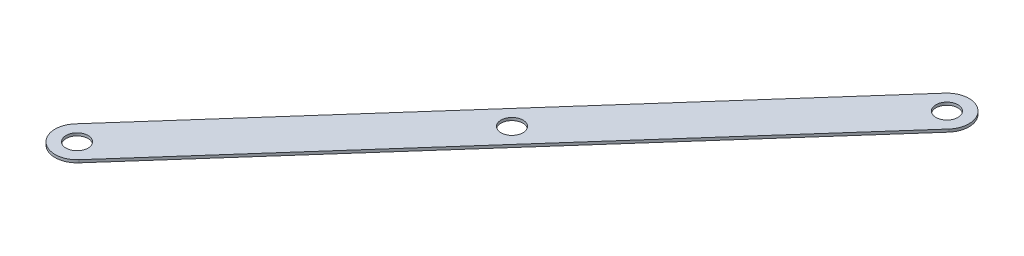
ISO-10303-21;
HEADER;
FILE_DESCRIPTION(('STEP AP214'),'2;1');
FILE_NAME('part.step','',(''),(''),'','','');
FILE_SCHEMA(('AUTOMOTIVE_DESIGN { 1 0 10303 214 1 1 1 1 }'));
ENDSEC;
DATA;
#1=APPLICATION_CONTEXT('core data for automotive mechanical design processes');
#2=APPLICATION_PROTOCOL_DEFINITION('international standard','automotive_design',2000,#1);
#3=PRODUCT_CONTEXT('',#1,'mechanical');
#4=PRODUCT('Part','Part','',(#3));
#5=PRODUCT_RELATED_PRODUCT_CATEGORY('part','',(#4));
#6=PRODUCT_DEFINITION_FORMATION('','',#4);
#7=PRODUCT_DEFINITION_CONTEXT('part definition',#1,'design');
#8=PRODUCT_DEFINITION('design','',#6,#7);
#9=PRODUCT_DEFINITION_SHAPE('','',#8);
#10=(LENGTH_UNIT() NAMED_UNIT(*) SI_UNIT(.MILLI.,.METRE.));
#11=(NAMED_UNIT(*) PLANE_ANGLE_UNIT() SI_UNIT($,.RADIAN.));
#12=(NAMED_UNIT(*) SI_UNIT($,.STERADIAN.) SOLID_ANGLE_UNIT());
#13=UNCERTAINTY_MEASURE_WITH_UNIT(LENGTH_MEASURE(1.E-05),#10,'distance_accuracy_value','');
#14=(GEOMETRIC_REPRESENTATION_CONTEXT(3) GLOBAL_UNCERTAINTY_ASSIGNED_CONTEXT((#13)) GLOBAL_UNIT_ASSIGNED_CONTEXT((#10,
#11,#12)) REPRESENTATION_CONTEXT('',''));
#15=CARTESIAN_POINT('',(0.,0.,0.));
#16=DIRECTION('',(0.,0.,1.));
#17=DIRECTION('',(1.,0.,0.));
#18=AXIS2_PLACEMENT_3D('',#15,#16,#17);
#19=CARTESIAN_POINT('',(0.,1.5875,0.));
#20=DIRECTION('',(0.,1.,0.));
#21=DIRECTION('',(0.,0.,1.));
#22=AXIS2_PLACEMENT_3D('',#19,#20,#21);
#23=PLANE('',#22);
#24=CARTESIAN_POINT('',(235.633683701559,1.5875,-266.323350657116));
#25=DIRECTION('',(0.,1.,0.));
#26=DIRECTION('',(0.,0.,1.));
#27=AXIS2_PLACEMENT_3D('',#24,#25,#26);
#28=CIRCLE('',#27,6.34999999999999);
#29=CARTESIAN_POINT('',(235.633683701559,1.5875,-259.973350657116));
#30=VERTEX_POINT('',#29);
#31=EDGE_CURVE('E118',#30,#30,#28,.T.);
#32=ORIENTED_EDGE('',*,*,#31,.F.);
#33=EDGE_LOOP('',(#32));
#34=FACE_BOUND('',#33,.T.);
#35=CARTESIAN_POINT('',(0.,1.5875,0.));
#36=DIRECTION('',(0.,1.,0.));
#37=DIRECTION('',(0.,0.,1.));
#38=AXIS2_PLACEMENT_3D('',#35,#36,#37);
#39=CIRCLE('',#38,12.7);
#40=CARTESIAN_POINT('',(-9.51154823775415,1.5875,-8.41548870362711));
#41=VERTEX_POINT('',#40);
#42=CARTESIAN_POINT('',(9.51154823775415,1.5875,8.41548870362712));
#43=VERTEX_POINT('',#42);
#44=EDGE_CURVE('E88',#41,#43,#39,.T.);
#45=ORIENTED_EDGE('',*,*,#44,.T.);
#46=DIRECTION('',(0.662636905797411,0.,-0.748940806122375));
#47=VECTOR('',#46,1.);
#48=CARTESIAN_POINT('',(9.51154823775415,1.5875,8.41548870362712));
#49=LINE('',#48,#47);
#50=CARTESIAN_POINT('',(245.145231939314,1.5875,-257.907861953489));
#51=VERTEX_POINT('',#50);
#52=EDGE_CURVE('E83',#43,#51,#49,.T.);
#53=ORIENTED_EDGE('',*,*,#52,.T.);
#54=CARTESIAN_POINT('',(235.633683701559,1.5875,-266.323350657116));
#55=DIRECTION('',(0.,1.,0.));
#56=DIRECTION('',(0.,0.,1.));
#57=AXIS2_PLACEMENT_3D('',#54,#55,#56);
#58=CIRCLE('',#57,12.7);
#59=CARTESIAN_POINT('',(226.122135463805,1.5875,-274.738839360744));
#60=VERTEX_POINT('',#59);
#61=EDGE_CURVE('E86',#51,#60,#58,.T.);
#62=ORIENTED_EDGE('',*,*,#61,.T.);
#63=DIRECTION('',(-0.662636905797411,0.,0.748940806122375));
#64=VECTOR('',#63,1.);
#65=CARTESIAN_POINT('',(-9.51154823775415,1.5875,-8.41548870362711));
#66=LINE('',#65,#64);
#67=EDGE_CURVE('E53',#60,#41,#66,.T.);
#68=ORIENTED_EDGE('',*,*,#67,.T.);
#69=EDGE_LOOP('',(#45,#53,#62,#68));
#70=FACE_BOUND('',#69,.T.);
#71=CARTESIAN_POINT('',(117.81684185078,1.5875,-133.161675328558));
#72=DIRECTION('',(0.,1.,0.));
#73=DIRECTION('',(0.,0.,1.));
#74=AXIS2_PLACEMENT_3D('',#71,#72,#73);
#75=CIRCLE('',#74,6.34999999999999);
#76=CARTESIAN_POINT('',(117.81684185078,1.5875,-126.811675328558));
#77=VERTEX_POINT('',#76);
#78=EDGE_CURVE('E103',#77,#77,#75,.T.);
#79=ORIENTED_EDGE('',*,*,#78,.F.);
#80=EDGE_LOOP('',(#79));
#81=FACE_BOUND('',#80,.T.);
#82=CARTESIAN_POINT('',(0.,1.5875,0.));
#83=DIRECTION('',(0.,1.,0.));
#84=DIRECTION('',(0.,0.,1.));
#85=AXIS2_PLACEMENT_3D('',#82,#83,#84);
#86=CIRCLE('',#85,6.35);
#87=CARTESIAN_POINT('',(0.,1.5875,6.35));
#88=VERTEX_POINT('',#87);
#89=EDGE_CURVE('E124',#88,#88,#86,.T.);
#90=ORIENTED_EDGE('',*,*,#89,.F.);
#91=EDGE_LOOP('',(#90));
#92=FACE_BOUND('',#91,.T.);
#93=ADVANCED_FACE('F36',(#34,#70,#81,#92),#23,.T.);
#94=CARTESIAN_POINT('',(0.,0.,0.));
#95=DIRECTION('',(0.,1.,0.));
#96=DIRECTION('',(0.,0.,1.));
#97=AXIS2_PLACEMENT_3D('',#94,#95,#96);
#98=PLANE('',#97);
#99=CARTESIAN_POINT('',(0.,0.,0.));
#100=DIRECTION('',(0.,1.,0.));
#101=DIRECTION('',(0.,0.,1.));
#102=AXIS2_PLACEMENT_3D('',#99,#100,#101);
#103=CIRCLE('',#102,12.7);
#104=CARTESIAN_POINT('',(-9.51154823775415,0.,-8.41548870362711));
#105=VERTEX_POINT('',#104);
#106=CARTESIAN_POINT('',(9.51154823775415,0.,8.41548870362712));
#107=VERTEX_POINT('',#106);
#108=EDGE_CURVE('E100',#105,#107,#103,.T.);
#109=ORIENTED_EDGE('',*,*,#108,.F.);
#110=DIRECTION('',(-0.662636905797411,0.,0.748940806122375));
#111=VECTOR('',#110,1.);
#112=CARTESIAN_POINT('',(-9.51154823775415,0.,-8.41548870362711));
#113=LINE('',#112,#111);
#114=CARTESIAN_POINT('',(226.122135463805,0.,-274.738839360744));
#115=VERTEX_POINT('',#114);
#116=EDGE_CURVE('E76',#115,#105,#113,.T.);
#117=ORIENTED_EDGE('',*,*,#116,.F.);
#118=CARTESIAN_POINT('',(235.633683701559,0.,-266.323350657116));
#119=DIRECTION('',(0.,1.,0.));
#120=DIRECTION('',(0.,0.,1.));
#121=AXIS2_PLACEMENT_3D('',#118,#119,#120);
#122=CIRCLE('',#121,12.7);
#123=CARTESIAN_POINT('',(245.145231939314,0.,-257.907861953489));
#124=VERTEX_POINT('',#123);
#125=EDGE_CURVE('E70',#124,#115,#122,.T.);
#126=ORIENTED_EDGE('',*,*,#125,.F.);
#127=DIRECTION('',(0.662636905797411,0.,-0.748940806122375));
#128=VECTOR('',#127,1.);
#129=CARTESIAN_POINT('',(9.51154823775415,0.,8.41548870362712));
#130=LINE('',#129,#128);
#131=EDGE_CURVE('E92',#107,#124,#130,.T.);
#132=ORIENTED_EDGE('',*,*,#131,.F.);
#133=EDGE_LOOP('',(#109,#117,#126,#132));
#134=FACE_BOUND('',#133,.T.);
#135=CARTESIAN_POINT('',(117.81684185078,0.,-133.161675328558));
#136=DIRECTION('',(0.,1.,0.));
#137=DIRECTION('',(0.,0.,1.));
#138=AXIS2_PLACEMENT_3D('',#135,#136,#137);
#139=CIRCLE('',#138,6.34999999999999);
#140=CARTESIAN_POINT('',(117.81684185078,0.,-126.811675328558));
#141=VERTEX_POINT('',#140);
#142=EDGE_CURVE('E115',#141,#141,#139,.T.);
#143=ORIENTED_EDGE('',*,*,#142,.T.);
#144=EDGE_LOOP('',(#143));
#145=FACE_BOUND('',#144,.T.);
#146=CARTESIAN_POINT('',(235.633683701559,0.,-266.323350657116));
#147=DIRECTION('',(0.,1.,0.));
#148=DIRECTION('',(0.,0.,1.));
#149=AXIS2_PLACEMENT_3D('',#146,#147,#148);
#150=CIRCLE('',#149,6.34999999999999);
#151=CARTESIAN_POINT('',(235.633683701559,0.,-259.973350657116));
#152=VERTEX_POINT('',#151);
#153=EDGE_CURVE('E121',#152,#152,#150,.T.);
#154=ORIENTED_EDGE('',*,*,#153,.T.);
#155=EDGE_LOOP('',(#154));
#156=FACE_BOUND('',#155,.T.);
#157=CARTESIAN_POINT('',(0.,0.,0.));
#158=DIRECTION('',(0.,1.,0.));
#159=DIRECTION('',(0.,0.,1.));
#160=AXIS2_PLACEMENT_3D('',#157,#158,#159);
#161=CIRCLE('',#160,6.35);
#162=CARTESIAN_POINT('',(0.,0.,6.35));
#163=VERTEX_POINT('',#162);
#164=EDGE_CURVE('E127',#163,#163,#161,.T.);
#165=ORIENTED_EDGE('',*,*,#164,.T.);
#166=EDGE_LOOP('',(#165));
#167=FACE_BOUND('',#166,.T.);
#168=ADVANCED_FACE('F111',(#134,#145,#156,#167),#98,.F.);
#169=CARTESIAN_POINT('',(0.,1.5875,0.));
#170=DIRECTION('',(0.,-1.,0.));
#171=DIRECTION('',(0.,0.,-1.));
#172=AXIS2_PLACEMENT_3D('',#169,#170,#171);
#173=CYLINDRICAL_SURFACE('',#172,12.7);
#174=ORIENTED_EDGE('',*,*,#108,.T.);
#175=DIRECTION('',(0.,-1.,0.));
#176=VECTOR('',#175,1.);
#177=CARTESIAN_POINT('',(9.51154823775415,1.5875,8.41548870362712));
#178=LINE('',#177,#176);
#179=EDGE_CURVE('E11',#43,#107,#178,.T.);
#180=ORIENTED_EDGE('',*,*,#179,.F.);
#181=ORIENTED_EDGE('',*,*,#44,.F.);
#182=DIRECTION('',(0.,-1.,0.));
#183=VECTOR('',#182,1.);
#184=CARTESIAN_POINT('',(-9.51154823775415,1.5875,-8.41548870362711));
#185=LINE('',#184,#183);
#186=EDGE_CURVE('E96',#41,#105,#185,.T.);
#187=ORIENTED_EDGE('',*,*,#186,.T.);
#188=EDGE_LOOP('',(#174,#180,#181,#187));
#189=FACE_BOUND('',#188,.T.);
#190=ADVANCED_FACE('F38',(#189),#173,.T.);
#191=CARTESIAN_POINT('',(9.51154823775415,1.5875,8.41548870362712));
#192=DIRECTION('',(-0.748940806122375,0.,-0.662636905797411));
#193=DIRECTION('',(-0.662636905797411,0.,0.748940806122375));
#194=AXIS2_PLACEMENT_3D('',#191,#192,#193);
#195=PLANE('',#194);
#196=ORIENTED_EDGE('',*,*,#131,.T.);
#197=DIRECTION('',(0.,-1.,0.));
#198=VECTOR('',#197,1.);
#199=CARTESIAN_POINT('',(245.145231939314,1.5875,-257.907861953489));
#200=LINE('',#199,#198);
#201=EDGE_CURVE('E45',#51,#124,#200,.T.);
#202=ORIENTED_EDGE('',*,*,#201,.F.);
#203=ORIENTED_EDGE('',*,*,#52,.F.);
#204=ORIENTED_EDGE('',*,*,#179,.T.);
#205=EDGE_LOOP('',(#196,#202,#203,#204));
#206=FACE_BOUND('',#205,.T.);
#207=ADVANCED_FACE('F91',(#206),#195,.F.);
#208=CARTESIAN_POINT('',(235.633683701559,1.5875,-266.323350657116));
#209=DIRECTION('',(0.,-1.,0.));
#210=DIRECTION('',(0.,0.,-1.));
#211=AXIS2_PLACEMENT_3D('',#208,#209,#210);
#212=CYLINDRICAL_SURFACE('',#211,12.7);
#213=ORIENTED_EDGE('',*,*,#125,.T.);
#214=DIRECTION('',(0.,-1.,0.));
#215=VECTOR('',#214,1.);
#216=CARTESIAN_POINT('',(226.122135463805,1.5875,-274.738839360744));
#217=LINE('',#216,#215);
#218=EDGE_CURVE('E93',#60,#115,#217,.T.);
#219=ORIENTED_EDGE('',*,*,#218,.F.);
#220=ORIENTED_EDGE('',*,*,#61,.F.);
#221=ORIENTED_EDGE('',*,*,#201,.T.);
#222=EDGE_LOOP('',(#213,#219,#220,#221));
#223=FACE_BOUND('',#222,.T.);
#224=ADVANCED_FACE('F94',(#223),#212,.T.);
#225=CARTESIAN_POINT('',(-9.51154823775415,1.5875,-8.41548870362711));
#226=DIRECTION('',(0.748940806122375,0.,0.662636905797411));
#227=DIRECTION('',(0.662636905797411,0.,-0.748940806122375));
#228=AXIS2_PLACEMENT_3D('',#225,#226,#227);
#229=PLANE('',#228);
#230=ORIENTED_EDGE('',*,*,#116,.T.);
#231=ORIENTED_EDGE('',*,*,#186,.F.);
#232=ORIENTED_EDGE('',*,*,#67,.F.);
#233=ORIENTED_EDGE('',*,*,#218,.T.);
#234=EDGE_LOOP('',(#230,#231,#232,#233));
#235=FACE_BOUND('',#234,.T.);
#236=ADVANCED_FACE('F108',(#235),#229,.F.);
#237=CARTESIAN_POINT('',(117.81684185078,1.5875,-133.161675328558));
#238=DIRECTION('',(0.,-1.,0.));
#239=DIRECTION('',(0.,0.,-1.));
#240=AXIS2_PLACEMENT_3D('',#237,#238,#239);
#241=CYLINDRICAL_SURFACE('',#240,6.34999999999999);
#242=ORIENTED_EDGE('',*,*,#78,.T.);
#243=EDGE_LOOP('',(#242));
#244=FACE_BOUND('',#243,.T.);
#245=ORIENTED_EDGE('',*,*,#142,.F.);
#246=EDGE_LOOP('',(#245));
#247=FACE_BOUND('',#246,.T.);
#248=ADVANCED_FACE('F145',(#244,#247),#241,.F.);
#249=CARTESIAN_POINT('',(235.633683701559,1.5875,-266.323350657116));
#250=DIRECTION('',(0.,-1.,0.));
#251=DIRECTION('',(0.,0.,-1.));
#252=AXIS2_PLACEMENT_3D('',#249,#250,#251);
#253=CYLINDRICAL_SURFACE('',#252,6.34999999999999);
#254=ORIENTED_EDGE('',*,*,#31,.T.);
#255=EDGE_LOOP('',(#254));
#256=FACE_BOUND('',#255,.T.);
#257=ORIENTED_EDGE('',*,*,#153,.F.);
#258=EDGE_LOOP('',(#257));
#259=FACE_BOUND('',#258,.T.);
#260=ADVANCED_FACE('F193',(#256,#259),#253,.F.);
#261=CARTESIAN_POINT('',(0.,1.5875,0.));
#262=DIRECTION('',(0.,-1.,0.));
#263=DIRECTION('',(0.,0.,-1.));
#264=AXIS2_PLACEMENT_3D('',#261,#262,#263);
#265=CYLINDRICAL_SURFACE('',#264,6.35);
#266=ORIENTED_EDGE('',*,*,#89,.T.);
#267=EDGE_LOOP('',(#266));
#268=FACE_BOUND('',#267,.T.);
#269=ORIENTED_EDGE('',*,*,#164,.F.);
#270=EDGE_LOOP('',(#269));
#271=FACE_BOUND('',#270,.T.);
#272=ADVANCED_FACE('F133',(#268,#271),#265,.F.);
#273=CLOSED_SHELL('',(#93,#168,#190,#207,#224,#236,#248,#260,#272));
#274=MANIFOLD_SOLID_BREP('B2',#273);
#275=ADVANCED_BREP_SHAPE_REPRESENTATION('',(#18,#274),#14);
#276=SHAPE_DEFINITION_REPRESENTATION(#9,#275);
ENDSEC;
END-ISO-10303-21;
